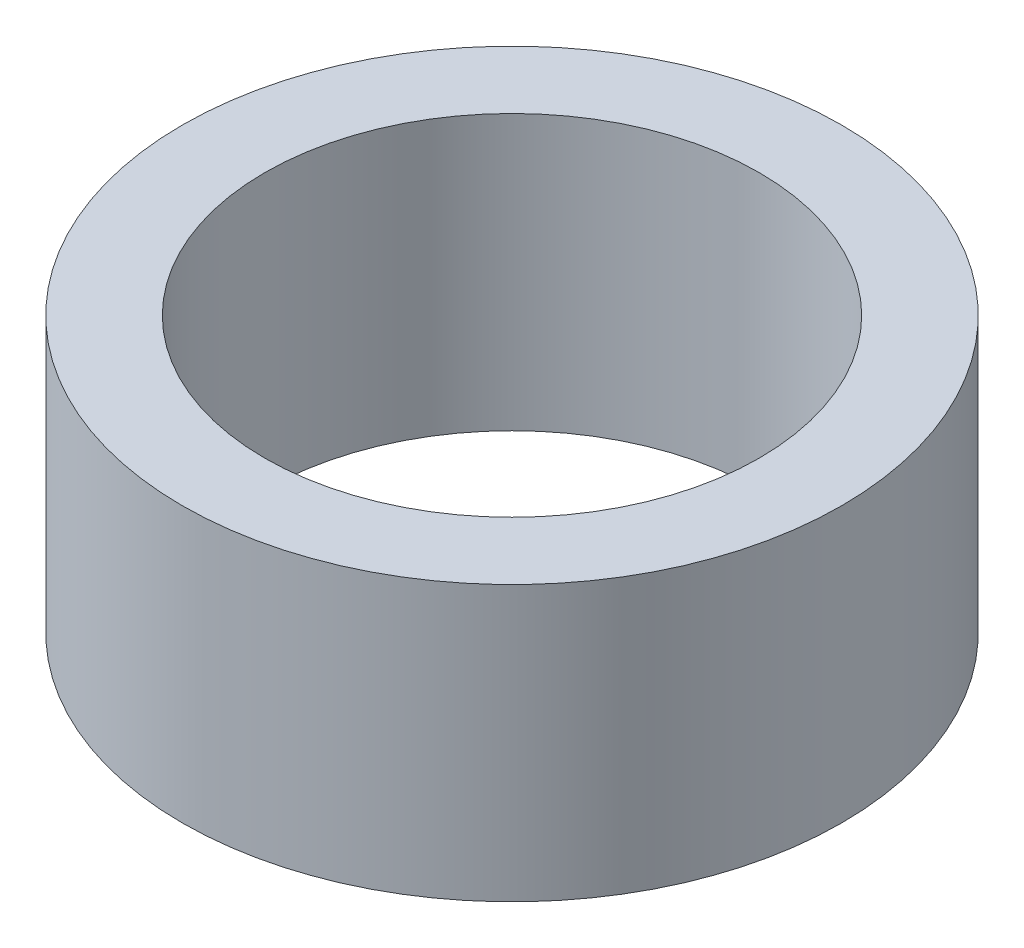
ISO-10303-21;
HEADER;
FILE_DESCRIPTION(('STEP AP214'),'2;1');
FILE_NAME('part.step','',(''),(''),'','','');
FILE_SCHEMA(('AUTOMOTIVE_DESIGN { 1 0 10303 214 1 1 1 1 }'));
ENDSEC;
DATA;
#1=APPLICATION_CONTEXT('core data for automotive mechanical design processes');
#2=APPLICATION_PROTOCOL_DEFINITION('international standard','automotive_design',2000,#1);
#3=PRODUCT_CONTEXT('',#1,'mechanical');
#4=PRODUCT('Part','Part','',(#3));
#5=PRODUCT_RELATED_PRODUCT_CATEGORY('part','',(#4));
#6=PRODUCT_DEFINITION_FORMATION('','',#4);
#7=PRODUCT_DEFINITION_CONTEXT('part definition',#1,'design');
#8=PRODUCT_DEFINITION('design','',#6,#7);
#9=PRODUCT_DEFINITION_SHAPE('','',#8);
#10=(LENGTH_UNIT() NAMED_UNIT(*) SI_UNIT(.MILLI.,.METRE.));
#11=(NAMED_UNIT(*) PLANE_ANGLE_UNIT() SI_UNIT($,.RADIAN.));
#12=(NAMED_UNIT(*) SI_UNIT($,.STERADIAN.) SOLID_ANGLE_UNIT());
#13=UNCERTAINTY_MEASURE_WITH_UNIT(LENGTH_MEASURE(1.E-05),#10,'distance_accuracy_value','');
#14=(GEOMETRIC_REPRESENTATION_CONTEXT(3) GLOBAL_UNCERTAINTY_ASSIGNED_CONTEXT((#13)) GLOBAL_UNIT_ASSIGNED_CONTEXT((#10,
#11,#12)) REPRESENTATION_CONTEXT('',''));
#15=CARTESIAN_POINT('',(0.,0.,0.));
#16=DIRECTION('',(0.,0.,1.));
#17=DIRECTION('',(1.,0.,0.));
#18=AXIS2_PLACEMENT_3D('',#15,#16,#17);
#19=CARTESIAN_POINT('',(0.,25.,0.));
#20=DIRECTION('',(0.,-1.,0.));
#21=DIRECTION('',(0.,0.,-1.));
#22=AXIS2_PLACEMENT_3D('',#19,#20,#21);
#23=CYLINDRICAL_SURFACE('',#22,22.5);
#24=CARTESIAN_POINT('',(0.,0.,0.));
#25=DIRECTION('',(0.,-1.,0.));
#26=DIRECTION('',(0.,0.,-1.));
#27=AXIS2_PLACEMENT_3D('',#24,#25,#26);
#28=CIRCLE('',#27,22.5);
#29=CARTESIAN_POINT('',(0.,0.,-22.5));
#30=VERTEX_POINT('',#29);
#31=EDGE_CURVE('E27',#30,#30,#28,.T.);
#32=ORIENTED_EDGE('',*,*,#31,.T.);
#33=EDGE_LOOP('',(#32));
#34=FACE_BOUND('',#33,.T.);
#35=CARTESIAN_POINT('',(0.,25.,0.));
#36=DIRECTION('',(0.,-1.,0.));
#37=DIRECTION('',(0.,0.,-1.));
#38=AXIS2_PLACEMENT_3D('',#35,#36,#37);
#39=CIRCLE('',#38,22.5);
#40=CARTESIAN_POINT('',(0.,25.,-22.5));
#41=VERTEX_POINT('',#40);
#42=EDGE_CURVE('E18',#41,#41,#39,.T.);
#43=ORIENTED_EDGE('',*,*,#42,.F.);
#44=EDGE_LOOP('',(#43));
#45=FACE_BOUND('',#44,.T.);
#46=ADVANCED_FACE('F15',(#34,#45),#23,.F.);
#47=CARTESIAN_POINT('',(0.,25.,0.));
#48=DIRECTION('',(0.,1.,0.));
#49=DIRECTION('',(0.,0.,1.));
#50=AXIS2_PLACEMENT_3D('',#47,#48,#49);
#51=PLANE('',#50);
#52=ORIENTED_EDGE('',*,*,#42,.T.);
#53=EDGE_LOOP('',(#52));
#54=FACE_BOUND('',#53,.T.);
#55=CARTESIAN_POINT('',(0.,25.,0.));
#56=DIRECTION('',(0.,-1.,0.));
#57=DIRECTION('',(0.,0.,-1.));
#58=AXIS2_PLACEMENT_3D('',#55,#56,#57);
#59=CIRCLE('',#58,30.);
#60=CARTESIAN_POINT('',(0.,25.,-30.));
#61=VERTEX_POINT('',#60);
#62=EDGE_CURVE('E22',#61,#61,#59,.T.);
#63=ORIENTED_EDGE('',*,*,#62,.F.);
#64=EDGE_LOOP('',(#63));
#65=FACE_BOUND('',#64,.T.);
#66=ADVANCED_FACE('F35',(#54,#65),#51,.T.);
#67=CARTESIAN_POINT('',(0.,0.,0.));
#68=DIRECTION('',(0.,1.,0.));
#69=DIRECTION('',(0.,0.,1.));
#70=AXIS2_PLACEMENT_3D('',#67,#68,#69);
#71=PLANE('',#70);
#72=ORIENTED_EDGE('',*,*,#31,.F.);
#73=EDGE_LOOP('',(#72));
#74=FACE_BOUND('',#73,.T.);
#75=CARTESIAN_POINT('',(0.,0.,0.));
#76=DIRECTION('',(0.,-1.,0.));
#77=DIRECTION('',(0.,0.,-1.));
#78=AXIS2_PLACEMENT_3D('',#75,#76,#77);
#79=CIRCLE('',#78,30.);
#80=CARTESIAN_POINT('',(0.,0.,-30.));
#81=VERTEX_POINT('',#80);
#82=EDGE_CURVE('E10',#81,#81,#79,.F.);
#83=ORIENTED_EDGE('',*,*,#82,.F.);
#84=EDGE_LOOP('',(#83));
#85=FACE_BOUND('',#84,.T.);
#86=ADVANCED_FACE('F44',(#74,#85),#71,.F.);
#87=CARTESIAN_POINT('',(0.,25.,0.));
#88=DIRECTION('',(0.,-1.,0.));
#89=DIRECTION('',(0.,0.,-1.));
#90=AXIS2_PLACEMENT_3D('',#87,#88,#89);
#91=CYLINDRICAL_SURFACE('',#90,30.);
#92=ORIENTED_EDGE('',*,*,#82,.T.);
#93=EDGE_LOOP('',(#92));
#94=FACE_BOUND('',#93,.T.);
#95=ORIENTED_EDGE('',*,*,#62,.T.);
#96=EDGE_LOOP('',(#95));
#97=FACE_BOUND('',#96,.T.);
#98=ADVANCED_FACE('F45',(#94,#97),#91,.T.);
#99=CLOSED_SHELL('',(#46,#66,#86,#98));
#100=MANIFOLD_SOLID_BREP('B1',#99);
#101=ADVANCED_BREP_SHAPE_REPRESENTATION('',(#18,#100),#14);
#102=SHAPE_DEFINITION_REPRESENTATION(#9,#101);
ENDSEC;
END-ISO-10303-21;
